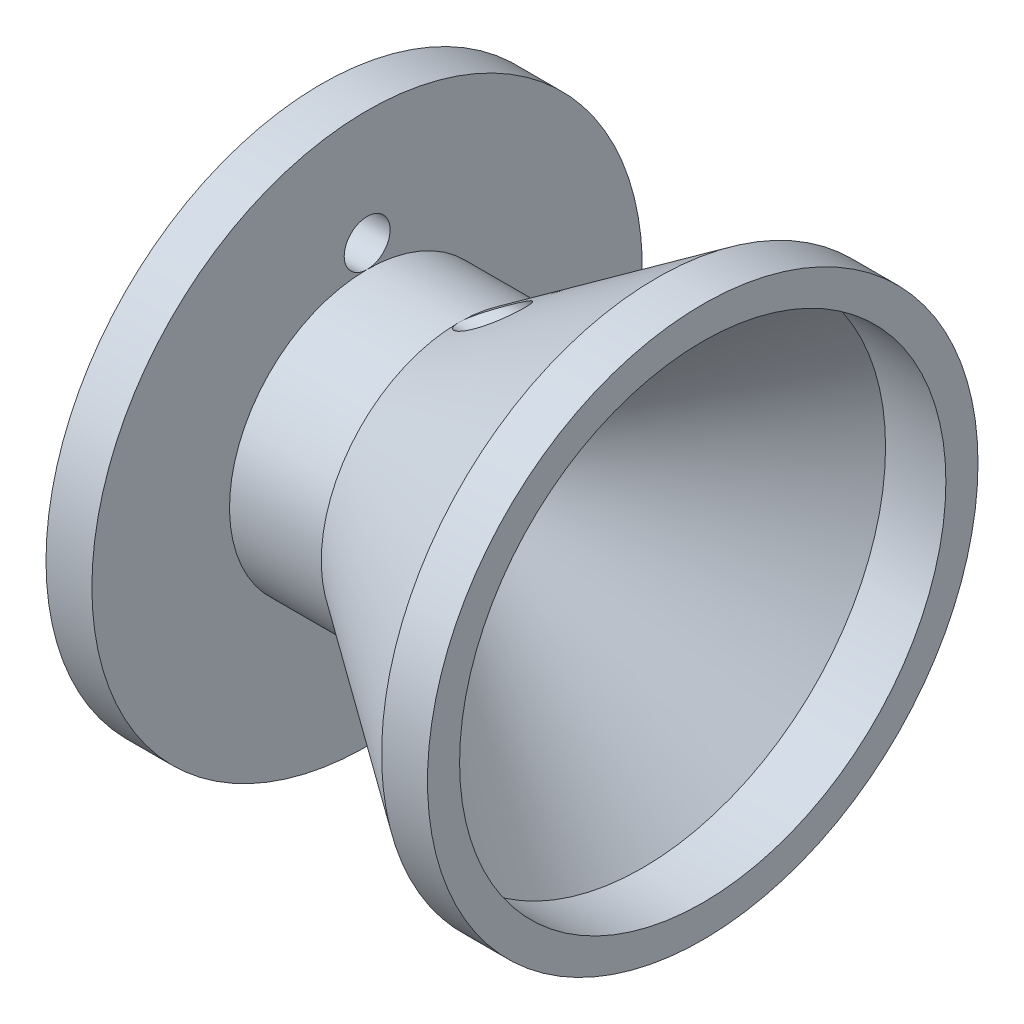
ISO-10303-21;
HEADER;
FILE_DESCRIPTION(('STEP AP214'),'2;1');
FILE_NAME('part.step','',(''),(''),'','','');
FILE_SCHEMA(('AUTOMOTIVE_DESIGN { 1 0 10303 214 1 1 1 1 }'));
ENDSEC;
DATA;
#1=APPLICATION_CONTEXT('core data for automotive mechanical design processes');
#2=APPLICATION_PROTOCOL_DEFINITION('international standard','automotive_design',2000,#1);
#3=PRODUCT_CONTEXT('',#1,'mechanical');
#4=PRODUCT('Part','Part','',(#3));
#5=PRODUCT_RELATED_PRODUCT_CATEGORY('part','',(#4));
#6=PRODUCT_DEFINITION_FORMATION('','',#4);
#7=PRODUCT_DEFINITION_CONTEXT('part definition',#1,'design');
#8=PRODUCT_DEFINITION('design','',#6,#7);
#9=PRODUCT_DEFINITION_SHAPE('','',#8);
#10=(LENGTH_UNIT() NAMED_UNIT(*) SI_UNIT(.MILLI.,.METRE.));
#11=(NAMED_UNIT(*) PLANE_ANGLE_UNIT() SI_UNIT($,.RADIAN.));
#12=(NAMED_UNIT(*) SI_UNIT($,.STERADIAN.) SOLID_ANGLE_UNIT());
#13=UNCERTAINTY_MEASURE_WITH_UNIT(LENGTH_MEASURE(1.E-05),#10,'distance_accuracy_value','');
#14=(GEOMETRIC_REPRESENTATION_CONTEXT(3) GLOBAL_UNCERTAINTY_ASSIGNED_CONTEXT((#13)) GLOBAL_UNIT_ASSIGNED_CONTEXT((#10,
#11,#12)) REPRESENTATION_CONTEXT('',''));
#15=CARTESIAN_POINT('',(0.,0.,0.));
#16=DIRECTION('',(0.,0.,1.));
#17=DIRECTION('',(1.,0.,0.));
#18=AXIS2_PLACEMENT_3D('',#15,#16,#17);
#19=CARTESIAN_POINT('',(12.,12.,12.));
#20=DIRECTION('',(-1.,0.,0.));
#21=DIRECTION('',(0.,0.,1.));
#22=AXIS2_PLACEMENT_3D('',#19,#20,#21);
#23=CYLINDRICAL_SURFACE('',#22,12.);
#24=CARTESIAN_POINT('',(14.63,12.,12.));
#25=DIRECTION('',(1.,0.,0.));
#26=DIRECTION('',(0.,0.,-1.));
#27=AXIS2_PLACEMENT_3D('',#24,#25,#26);
#28=CIRCLE('',#27,12.);
#29=CARTESIAN_POINT('',(14.63,12.,0.));
#30=VERTEX_POINT('',#29);
#31=EDGE_CURVE('E84',#30,#30,#28,.T.);
#32=ORIENTED_EDGE('',*,*,#31,.F.);
#33=EDGE_LOOP('',(#32));
#34=FACE_BOUND('',#33,.T.);
#35=CARTESIAN_POINT('',(12.63,12.,12.));
#36=DIRECTION('',(1.,0.,0.));
#37=DIRECTION('',(0.,0.,-1.));
#38=AXIS2_PLACEMENT_3D('',#35,#36,#37);
#39=CIRCLE('',#38,12.);
#40=CARTESIAN_POINT('',(12.63,12.,0.));
#41=VERTEX_POINT('',#40);
#42=EDGE_CURVE('E114',#41,#41,#39,.T.);
#43=ORIENTED_EDGE('',*,*,#42,.T.);
#44=EDGE_LOOP('',(#43));
#45=FACE_BOUND('',#44,.T.);
#46=ADVANCED_FACE('F45',(#34,#45),#23,.T.);
#47=CARTESIAN_POINT('',(48.,19.,12.));
#48=DIRECTION('',(-1.,0.,0.));
#49=DIRECTION('',(0.,0.,1.));
#50=AXIS2_PLACEMENT_3D('',#47,#48,#49);
#51=CYLINDRICAL_SURFACE('',#50,1.);
#52=CARTESIAN_POINT('',(9.33017925939777,19.9205530775845,12.3906175000557));
#53=CARTESIAN_POINT('',(9.31075114274671,19.8985433378205,12.44247297199));
#54=CARTESIAN_POINT('',(9.28775626365183,19.8725740585792,12.491422278081));
#55=CARTESIAN_POINT('',(9.23618243469897,19.8146490916046,12.5824856636763));
#56=CARTESIAN_POINT('',(9.20757826695552,19.7826663969329,12.6245672413248));
#57=CARTESIAN_POINT('',(9.13920647714863,19.7067075370633,12.7103107576778));
#58=CARTESIAN_POINT('',(9.09837816770717,19.6616561586324,12.7521681068706));
#59=CARTESIAN_POINT('',(9.0123661533531,19.5675899736042,12.8254737911489));
#60=CARTESIAN_POINT('',(8.96718035808321,19.5185732666087,12.8569170980528));
#61=CARTESIAN_POINT('',(8.85895660612349,19.4023045873099,12.9185570867299));
#62=CARTESIAN_POINT('',(8.79480490815994,19.3342032875128,12.9451896347475));
#63=CARTESIAN_POINT('',(8.66347770865847,19.1966984712546,12.9830591404249));
#64=CARTESIAN_POINT('',(8.59629900106422,19.1272936217586,12.9942793584964));
#65=CARTESIAN_POINT('',(8.45934531605116,18.987827574803,13.0024050361181));
#66=CARTESIAN_POINT('',(8.38954542406175,18.9177765623652,12.9990531315719));
#67=CARTESIAN_POINT('',(8.24998037326568,18.7798118071044,12.9779514730343));
#68=CARTESIAN_POINT('',(8.1802152194349,18.7118983134684,12.9602000467894));
#69=CARTESIAN_POINT('',(8.04724705392241,18.5844131323782,12.9119234956999));
#70=CARTESIAN_POINT('',(7.98392748382353,18.524590641074,12.882383971102));
#71=CARTESIAN_POINT('',(7.86060823709407,18.4096919335184,12.8100244834528));
#72=CARTESIAN_POINT('',(7.80060349322348,18.3546083968831,12.7672254909971));
#73=CARTESIAN_POINT('',(7.70645375520955,18.2692822627952,12.6843033722741));
#74=CARTESIAN_POINT('',(7.6705075052636,18.2370074801461,12.6483135981689));
#75=CARTESIAN_POINT('',(7.60269199892421,18.1765891574752,12.5696044569454));
#76=CARTESIAN_POINT('',(7.57081678652361,18.1484395731027,12.5268951298229));
#77=CARTESIAN_POINT('',(7.52003390655837,18.1038806428,12.4456145503246));
#78=CARTESIAN_POINT('',(7.49984938277972,18.0862745565097,12.4085055892172));
#79=CARTESIAN_POINT('',(7.46414612920811,18.0552535440822,12.3304681708559));
#80=CARTESIAN_POINT('',(7.44862089391286,18.0418327731898,12.2895451446556));
#81=CARTESIAN_POINT('',(7.42556971940805,18.0219556303404,12.2115901347126));
#82=CARTESIAN_POINT('',(7.41714790429687,18.0147166885762,12.1750258209518));
#83=CARTESIAN_POINT('',(7.40508673750228,18.0043592323075,12.100545943482));
#84=CARTESIAN_POINT('',(7.401444149957,18.0012379298735,12.0626313119132));
#85=CARTESIAN_POINT('',(7.39925900520462,17.9993647921611,11.9864658399914));
#86=CARTESIAN_POINT('',(7.40072693410073,18.0006219408869,11.948214469191));
#87=CARTESIAN_POINT('',(7.40865065434625,18.0074191328017,11.872621813915));
#88=CARTESIAN_POINT('',(7.41510843024446,18.0129608800505,11.8352808976397));
#89=CARTESIAN_POINT('',(7.43229345080156,18.0277495477946,11.7632407301839));
#90=CARTESIAN_POINT('',(7.44292938584377,18.0369172539382,11.7285027570606));
#91=CARTESIAN_POINT('',(7.46777905745319,18.0584134245711,11.6613867793909));
#92=CARTESIAN_POINT('',(7.48199434001563,18.0707432548909,11.6290098024212));
#93=CARTESIAN_POINT('',(7.52193569564445,18.1055367012051,11.5497756148684));
#94=CARTESIAN_POINT('',(7.54969237624421,18.129843955885,11.5047493575443));
#95=CARTESIAN_POINT('',(7.61000761369345,18.1830911798965,11.4210941364123));
#96=CARTESIAN_POINT('',(7.64257887087161,18.2120434199863,11.3824826844942));
#97=CARTESIAN_POINT('',(7.72656724215055,18.2873566966712,11.2951482546054));
#98=CARTESIAN_POINT('',(7.7798066902739,18.3356370582277,11.2498399867908));
#99=CARTESIAN_POINT('',(7.89013744651056,18.4370580133804,11.1710075112159));
#100=CARTESIAN_POINT('',(7.94723440357425,18.4902057771346,11.1375010522703));
#101=CARTESIAN_POINT('',(8.08056895976431,18.6160264034317,11.0732236022831));
#102=CARTESIAN_POINT('',(8.15750565751286,18.6898514363039,11.0461421348696));
#103=CARTESIAN_POINT('',(8.31225215853798,18.8409442317202,11.009674927801));
#104=CARTESIAN_POINT('',(8.3900628132803,18.9182156181801,11.0003082871993));
#105=CARTESIAN_POINT('',(8.54494037593803,19.0745813434864,10.9997046169268));
#106=CARTESIAN_POINT('',(8.62199963457183,19.1536840380307,11.0085808522837));
#107=CARTESIAN_POINT('',(8.77251971644381,19.3106014975334,11.0460556811667));
#108=CARTESIAN_POINT('',(8.84598835491456,19.3884187910141,11.0746091922761));
#109=CARTESIAN_POINT('',(8.9613242703613,19.5122540115348,11.1394185405039));
#110=CARTESIAN_POINT('',(9.00516181361281,19.5597659581886,11.1693561297225));
#111=CARTESIAN_POINT('',(9.08881678507618,19.651154804155,11.2388929693238));
#112=CARTESIAN_POINT('',(9.12863999078595,19.6950369107742,11.2784780459234));
#113=CARTESIAN_POINT('',(9.19465519623506,19.7682714408776,11.3581081812015));
#114=CARTESIAN_POINT('',(9.22193880009028,19.7987214373879,11.3962331841705));
#115=CARTESIAN_POINT('',(9.27192846942013,19.8547596294178,11.4785999927412));
#116=CARTESIAN_POINT('',(9.29463979525632,19.8803534099936,11.5228346692415));
#117=CARTESIAN_POINT('',(9.3308790087273,19.9213264078015,11.608817407619));
#118=CARTESIAN_POINT('',(9.3453122059246,19.9377029395606,11.6497056424218));
#119=CARTESIAN_POINT('',(9.36946052051875,19.9651538795859,11.7345542085725));
#120=CARTESIAN_POINT('',(9.37917858010852,19.9762315941934,11.7785126045319));
#121=CARTESIAN_POINT('',(9.3933385300539,19.992386363676,11.8685803682292));
#122=CARTESIAN_POINT('',(9.39775567984746,19.9974352802248,11.9146987862768));
#123=CARTESIAN_POINT('',(9.4009163372701,20.0010470880333,12.0074024132576));
#124=CARTESIAN_POINT('',(9.39965882623039,19.9996088147657,12.0539877045022));
#125=CARTESIAN_POINT('',(9.39189531796824,19.9907413133481,12.142276129684));
#126=CARTESIAN_POINT('',(9.38582121055548,19.983805090315,12.1840697961231));
#127=CARTESIAN_POINT('',(9.36931670549173,19.9649958353175,12.2655689083097));
#128=CARTESIAN_POINT('',(9.35889329406206,19.9531307206923,12.3052775884897));
#129=CARTESIAN_POINT('',(9.34143162339152,19.9333078599969,12.3594824116148));
#130=CARTESIAN_POINT('',(9.33596352207592,19.927105957545,12.3751787585474));
#131=CARTESIAN_POINT('',(9.33017925939777,19.9205530775845,12.3906175000557));
#132=B_SPLINE_CURVE_WITH_KNOTS('',3,(#52,#53,#54,#55,#56,#57,#58,#59,#60,#61,#62,#63,#64,#65,
#66,#67,#68,#69,#70,#71,#72,#73,#74,#75,#76,#77,#78,#79,#80,#81,#82,#83,#84,#85,#86,#87,#88,#89,
#90,#91,#92,#93,#94,#95,#96,#97,#98,#99,#100,#101,#102,#103,#104,#105,#106,#107,#108,#109,#110,
#111,#112,#113,#114,#115,#116,#117,#118,#119,#120,#121,#122,#123,#124,#125,#126,#127,#128,#129,
#130,#131),.UNSPECIFIED.,.T.,.F.,(4,2,2,2,2,2,2,2,2,2,2,2,2,2,2,2,2,2,2,2,2,2,2,2,2,2,2,2,2,2,2,
2,2,2,2,2,2,2,2,4),(0.,0.17871221089598,0.358247087796716,0.578484198389451,0.798827490928976,
1.0891157384978,1.37971902433362,1.67547542381294,1.97126617516469,2.24626515954673,
2.52083141886618,2.70105784477098,2.88101749955363,3.01783777563337,3.15446611884785,
3.26861397439845,3.38268450414195,3.49698922933851,3.61133943892354,3.72331845264719,
3.83534591566975,4.00899402860083,4.18310866271044,4.4365977524336,4.6904664544158,
5.01884949611941,5.34758637915288,5.6783704642954,6.00839920183975,6.22143928903462,
6.43416825154415,6.60126599440556,6.76817038027452,6.90664564968333,7.04503440059757,
7.18406656240745,7.32312368312916,7.45095513312017,7.57858203505205,7.63178937316833),.UNSPECIFIED.);
#133=CARTESIAN_POINT('',(9.33017925939777,19.9205530775845,12.3906175000557));
#134=VERTEX_POINT('',#133);
#135=EDGE_CURVE('E51',#134,#134,#132,.T.);
#136=ORIENTED_EDGE('',*,*,#135,.T.);
#137=EDGE_LOOP('',(#136));
#138=FACE_BOUND('',#137,.T.);
#139=CARTESIAN_POINT('',(4.40293240857594,18.2457241063854,11.3434423233877));
#140=CARTESIAN_POINT('',(4.44628297337378,18.2727641558073,11.3123772749513));
#141=CARTESIAN_POINT('',(4.49092850828376,18.3008078844389,11.2840125946292));
#142=CARTESIAN_POINT('',(4.58195611134168,18.3584253358973,11.2319576063296));
#143=CARTESIAN_POINT('',(4.62833979238464,18.3880004900214,11.2082717745705));
#144=CARTESIAN_POINT('',(4.72245072867775,18.4484723223752,11.1650123614738));
#145=CARTESIAN_POINT('',(4.77018276384847,18.4793739788617,11.1454562670796));
#146=CARTESIAN_POINT('',(4.86642929814047,18.5421683226007,11.1102328282135));
#147=CARTESIAN_POINT('',(4.91494401541581,18.5740612885354,11.0945665886096));
#148=CARTESIAN_POINT('',(5.0324481798698,18.6519051774671,11.0612315231402));
#149=CARTESIAN_POINT('',(5.10168508147372,18.6982637534419,11.0453705584746));
#150=CARTESIAN_POINT('',(5.24056745270534,18.7922585039973,11.0206096821607));
#151=CARTESIAN_POINT('',(5.31021311508869,18.839895326823,11.0117133742838));
#152=CARTESIAN_POINT('',(5.4493098691186,18.9360403841126,11.000877457986));
#153=CARTESIAN_POINT('',(5.51876109661839,18.9845472839885,10.9989279812196));
#154=CARTESIAN_POINT('',(5.65703563542604,19.0821101873946,11.0021831317591));
#155=CARTESIAN_POINT('',(5.72585926220369,19.1311658839071,11.0073839397558));
#156=CARTESIAN_POINT('',(5.88622254054825,19.2466008845581,11.0285387411028));
#157=CARTESIAN_POINT('',(5.97733895103311,19.3130722361096,11.0476031903253));
#158=CARTESIAN_POINT('',(6.11099901700916,19.4117952220287,11.0880343300412));
#159=CARTESIAN_POINT('',(6.15502831910602,19.4445224817414,11.1034729321172));
#160=CARTESIAN_POINT('',(6.24176957382369,19.5093822184592,11.1386687623264));
#161=CARTESIAN_POINT('',(6.28448210672959,19.5415149548935,11.1584240561784));
#162=CARTESIAN_POINT('',(6.37936466886369,19.6133002635991,11.2086305227701));
#163=CARTESIAN_POINT('',(6.4310045851915,19.6526624621719,11.2405292613783));
#164=CARTESIAN_POINT('',(6.53003243141091,19.7286390364843,11.3130938227406));
#165=CARTESIAN_POINT('',(6.57742576018577,19.7652568912551,11.3537482834004));
#166=CARTESIAN_POINT('',(6.65310379230284,19.8240545296136,11.432021755652));
#167=CARTESIAN_POINT('',(6.68298986853447,19.8473788977052,11.4672163209486));
#168=CARTESIAN_POINT('',(6.73810250806339,19.8905378493739,11.5430133020236));
#169=CARTESIAN_POINT('',(6.763336426391,19.9103779391744,11.5836070037871));
#170=CARTESIAN_POINT('',(6.80239324715166,19.941164913777,11.6601501154448));
#171=CARTESIAN_POINT('',(6.81750597379604,19.9531078997677,11.6950336763814));
#172=CARTESIAN_POINT('',(6.84304736517481,19.9733204641057,11.7674965432831));
#173=CARTESIAN_POINT('',(6.85347973933996,19.981592951463,11.8050736869451));
#174=CARTESIAN_POINT('',(6.86889971945204,19.9938285550267,11.8823404518066));
#175=CARTESIAN_POINT('',(6.8738459669363,19.9977589363737,11.9220437851379));
#176=CARTESIAN_POINT('',(6.87766769381627,20.0007952627776,12.001922569819));
#177=CARTESIAN_POINT('',(6.87654576525055,19.9999032677263,12.042097812275));
#178=CARTESIAN_POINT('',(6.86882956327758,19.9937746161223,12.1168622680584));
#179=CARTESIAN_POINT('',(6.86287723571762,19.9890476365347,12.1515639614357));
#180=CARTESIAN_POINT('',(6.84675581899237,19.9762623819599,12.2193221833807));
#181=CARTESIAN_POINT('',(6.83658512333807,19.9682028378294,12.2523780797989));
#182=CARTESIAN_POINT('',(6.80863007106097,19.9460912311966,12.3269328638836));
#183=CARTESIAN_POINT('',(6.7894380190028,19.9309372524358,12.3675750650857));
#184=CARTESIAN_POINT('',(6.74610551763846,19.8968322518691,12.4443723909753));
#185=CARTESIAN_POINT('',(6.72195533143078,19.8778737603478,12.480518458261));
#186=CARTESIAN_POINT('',(6.6580539318027,19.8278976402971,12.5638346809883));
#187=CARTESIAN_POINT('',(6.61622421888744,19.7953344939788,12.6084685716443));
#188=CARTESIAN_POINT('',(6.52745363400783,19.7266676918075,12.6890326363499));
#189=CARTESIAN_POINT('',(6.48050246362361,19.6905569172858,12.7249447868032));
#190=CARTESIAN_POINT('',(6.39309630497161,19.62379096354,12.7825667396327));
#191=CARTESIAN_POINT('',(6.35325661390166,19.5935158096762,12.8056797384461));
#192=CARTESIAN_POINT('',(6.2719623030953,19.5320877828112,12.8475040238878));
#193=CARTESIAN_POINT('',(6.230506769121,19.5009344157619,12.8662127752031));
#194=CARTESIAN_POINT('',(6.10424833012133,19.4066151377853,12.9163803970968));
#195=CARTESIAN_POINT('',(6.01762284242353,19.3426430767951,12.9418374783116));
#196=CARTESIAN_POINT('',(5.86507294167971,19.2314037953313,12.9740921087023));
#197=CARTESIAN_POINT('',(5.79971735155917,19.1841826776705,12.9840407782333));
#198=CARTESIAN_POINT('',(5.66808831455722,19.0899816216771,12.9970785866338));
#199=CARTESIAN_POINT('',(5.6018144114151,19.0430018203821,13.0001641829493));
#200=CARTESIAN_POINT('',(5.46875805101483,18.9496029616764,12.9998221459536));
#201=CARTESIAN_POINT('',(5.40197497804371,18.9031848556207,12.9963846937208));
#202=CARTESIAN_POINT('',(5.26842545452808,18.8112860602218,12.9831286662177));
#203=CARTESIAN_POINT('',(5.20165900672121,18.7658050375184,12.9733124020569));
#204=CARTESIAN_POINT('',(5.08136709316957,18.6846906594248,12.9497388378276));
#205=CARTESIAN_POINT('',(5.02776330310297,18.6488448024938,12.9371017400017));
#206=CARTESIAN_POINT('',(4.92112906819844,18.5781233969034,12.907463746886));
#207=CARTESIAN_POINT('',(4.86809851423388,18.5432476615003,12.8904636979773));
#208=CARTESIAN_POINT('',(4.76317666598929,18.4748131657734,12.8518897335114));
#209=CARTESIAN_POINT('',(4.71128165410016,18.4412496824032,12.8303344451544));
#210=CARTESIAN_POINT('',(4.60895231409541,18.3756046498811,12.7821686806351));
#211=CARTESIAN_POINT('',(4.5585168855054,18.3435219727892,12.7555621337666));
#212=CARTESIAN_POINT('',(4.46479287795249,18.2843738169927,12.6995489553152));
#213=CARTESIAN_POINT('',(4.42129440771217,18.2571276545217,12.6706896088583));
#214=CARTESIAN_POINT('',(4.33688401536243,18.2046154851001,12.6074988918326));
#215=CARTESIAN_POINT('',(4.29597860327162,18.1793544265399,12.5731544559318));
#216=CARTESIAN_POINT('',(4.21781039318862,18.1313838707779,12.4975442113376));
#217=CARTESIAN_POINT('',(4.18061245150044,18.1087190192924,12.4561810872735));
#218=CARTESIAN_POINT('',(4.11352724053155,18.0680605920529,12.3659306588487));
#219=CARTESIAN_POINT('',(4.08359813081104,18.0500402432403,12.3170891897222));
#220=CARTESIAN_POINT('',(4.04694322558946,18.0280451278385,12.2369068139269));
#221=CARTESIAN_POINT('',(4.03594320128644,18.0214613714609,12.208242973502));
#222=CARTESIAN_POINT('',(4.01801368965979,18.0107433006263,12.1492224850171));
#223=CARTESIAN_POINT('',(4.01108006106003,18.0066064941233,12.1188675937773));
#224=CARTESIAN_POINT('',(4.00191288168589,18.001139275928,12.0569820704453));
#225=CARTESIAN_POINT('',(3.99971041339515,17.9998274233048,12.0254450396319));
#226=CARTESIAN_POINT('',(4.00035116600848,18.0002092736411,11.9624394153051));
#227=CARTESIAN_POINT('',(4.00319454543074,18.0019030710248,11.9309708239729));
#228=CARTESIAN_POINT('',(4.01319610825531,18.0078692055526,11.8715474950462));
#229=CARTESIAN_POINT('',(4.02000197376527,18.0119310291414,11.8435096845962));
#230=CARTESIAN_POINT('',(4.03707117229449,18.0221366791297,11.7889168860302));
#231=CARTESIAN_POINT('',(4.04733651676938,18.0282817167913,11.7623627710795));
#232=CARTESIAN_POINT('',(4.07710067668132,18.0461405234375,11.6969304162394));
#233=CARTESIAN_POINT('',(4.09857533874079,18.0590597848598,11.6592842428522));
#234=CARTESIAN_POINT('',(4.14621289134357,18.0878507696889,11.5883464668789));
#235=CARTESIAN_POINT('',(4.17238805536187,18.1037302266942,11.5550666687489));
#236=CARTESIAN_POINT('',(4.23088659705899,18.1393997449631,11.4892022643983));
#237=CARTESIAN_POINT('',(4.26356791384548,18.1594262133705,11.4570697038988));
#238=CARTESIAN_POINT('',(4.33151099372381,18.2013111144213,11.3971476408747));
#239=CARTESIAN_POINT('',(4.36677116787208,18.2231684201943,11.3693554965891));
#240=CARTESIAN_POINT('',(4.40293240857594,18.2457241063854,11.3434423233877));
#241=B_SPLINE_CURVE_WITH_KNOTS('',3,(#139,#140,#141,#142,#143,#144,#145,#146,#147,#148,#149,
#150,#151,#152,#153,#154,#155,#156,#157,#158,#159,#160,#161,#162,#163,#164,#165,#166,#167,#168,
#169,#170,#171,#172,#173,#174,#175,#176,#177,#178,#179,#180,#181,#182,#183,#184,#185,#186,#187,
#188,#189,#190,#191,#192,#193,#194,#195,#196,#197,#198,#199,#200,#201,#202,#203,#204,#205,#206,
#207,#208,#209,#210,#211,#212,#213,#214,#215,#216,#217,#218,#219,#220,#221,#222,#223,#224,#225,
#226,#227,#228,#229,#230,#231,#232,#233,#234,#235,#236,#237,#238,#239,#240),.UNSPECIFIED.,.T.,
.F.,(4,2,2,2,2,2,2,2,2,2,2,2,2,2,2,2,2,2,2,2,2,2,2,2,2,2,2,2,2,2,2,2,2,2,2,2,2,2,2,2,2,2,2,2,2,
2,2,2,2,2,4),(0.,0.179319781974265,0.358810295685759,0.539046243839757,0.719333327502907,
0.973462033552717,1.2277221484567,1.48162092895095,1.73538414263633,2.07739243644159,
2.24822290265808,2.418976977271,2.63545418948869,2.85165215899259,3.00636925253851,
3.16083960153671,3.27992940286886,3.398924651672,3.5188110026212,3.63864614782193,
3.74474649832067,3.85088729236999,3.99239381993463,4.13418094618551,4.34092681657204,
4.54809636252173,4.71322349517899,4.87844545238283,5.20917805158772,5.45264407407527,
5.69623573875709,5.94019436451292,6.18406465078172,6.38105946121695,6.57801608492631,
6.77418238435578,6.97019670977349,7.14658038427805,7.32339064416377,7.50288978714186,
7.6813298242368,7.7751965521005,7.86896751798127,7.96335267397814,8.0577407951911,
8.14479711605003,8.23190414191798,8.36680483269214,8.5020630243146,8.65173559396198,
8.80131670851436),.UNSPECIFIED.);
#242=CARTESIAN_POINT('',(4.00000000000002,18.,12.));
#243=VERTEX_POINT('',#242);
#244=EDGE_CURVE('E110',#243,#243,#241,.T.);
#245=ORIENTED_EDGE('',*,*,#244,.F.);
#246=EDGE_LOOP('',(#245));
#247=FACE_BOUND('',#246,.T.);
#248=ADVANCED_FACE('F105',(#138,#247),#51,.F.);
#249=CARTESIAN_POINT('',(10.,12.,12.));
#250=DIRECTION('',(-1.,0.,0.));
#251=DIRECTION('',(0.,0.,1.));
#252=AXIS2_PLACEMENT_3D('',#249,#250,#251);
#253=CYLINDRICAL_SURFACE('',#252,6.);
#254=CARTESIAN_POINT('',(4.00000000000002,12.,12.));
#255=DIRECTION('',(1.,0.,0.));
#256=DIRECTION('',(0.,0.,-1.));
#257=AXIS2_PLACEMENT_3D('',#254,#255,#256);
#258=CIRCLE('',#257,6.);
#259=EDGE_CURVE('E66',#243,#243,#258,.F.);
#260=ORIENTED_EDGE('',*,*,#259,.T.);
#261=EDGE_LOOP('',(#260));
#262=FACE_BOUND('',#261,.T.);
#263=CARTESIAN_POINT('',(0.,12.,12.));
#264=DIRECTION('',(1.,0.,0.));
#265=DIRECTION('',(0.,0.,-1.));
#266=AXIS2_PLACEMENT_3D('',#263,#264,#265);
#267=CIRCLE('',#266,6.);
#268=CARTESIAN_POINT('',(0.,18.,12.));
#269=VERTEX_POINT('',#268);
#270=EDGE_CURVE('E172',#269,#269,#267,.T.);
#271=ORIENTED_EDGE('',*,*,#270,.T.);
#272=EDGE_LOOP('',(#271));
#273=FACE_BOUND('',#272,.T.);
#274=ADVANCED_FACE('F108',(#262,#273),#253,.T.);
#275=CARTESIAN_POINT('',(-2.,12.,12.));
#276=DIRECTION('',(1.,0.,0.));
#277=DIRECTION('',(0.,0.,-1.));
#278=AXIS2_PLACEMENT_3D('',#275,#276,#277);
#279=CYLINDRICAL_SURFACE('',#278,12.);
#280=CARTESIAN_POINT('',(-2.,12.,12.));
#281=DIRECTION('',(-1.,0.,0.));
#282=DIRECTION('',(0.,0.,1.));
#283=AXIS2_PLACEMENT_3D('',#280,#281,#282);
#284=CIRCLE('',#283,12.);
#285=CARTESIAN_POINT('',(-2.,12.,24.));
#286=VERTEX_POINT('',#285);
#287=EDGE_CURVE('E175',#286,#286,#284,.T.);
#288=ORIENTED_EDGE('',*,*,#287,.F.);
#289=EDGE_LOOP('',(#288));
#290=FACE_BOUND('',#289,.T.);
#291=CARTESIAN_POINT('',(0.,12.,12.));
#292=DIRECTION('',(-1.,0.,0.));
#293=DIRECTION('',(0.,0.,1.));
#294=AXIS2_PLACEMENT_3D('',#291,#292,#293);
#295=CIRCLE('',#294,12.);
#296=CARTESIAN_POINT('',(0.,12.,24.));
#297=VERTEX_POINT('',#296);
#298=EDGE_CURVE('E82',#297,#297,#295,.T.);
#299=ORIENTED_EDGE('',*,*,#298,.T.);
#300=EDGE_LOOP('',(#299));
#301=FACE_BOUND('',#300,.T.);
#302=ADVANCED_FACE('F153',(#290,#301),#279,.T.);
#303=CARTESIAN_POINT('',(-2.,12.,12.));
#304=DIRECTION('',(-1.,0.,0.));
#305=DIRECTION('',(0.,0.,1.));
#306=AXIS2_PLACEMENT_3D('',#303,#304,#305);
#307=PLANE('',#306);
#308=CARTESIAN_POINT('',(-2.,19.,12.));
#309=DIRECTION('',(-1.,0.,0.));
#310=DIRECTION('',(0.,0.,1.));
#311=AXIS2_PLACEMENT_3D('',#308,#309,#310);
#312=CIRCLE('',#311,1.);
#313=CARTESIAN_POINT('',(-2.,19.,13.));
#314=VERTEX_POINT('',#313);
#315=EDGE_CURVE('E77',#314,#314,#312,.T.);
#316=ORIENTED_EDGE('',*,*,#315,.F.);
#317=EDGE_LOOP('',(#316));
#318=FACE_BOUND('',#317,.T.);
#319=CARTESIAN_POINT('',(-2.,12.,12.));
#320=DIRECTION('',(-1.,0.,0.));
#321=DIRECTION('',(0.,0.,1.));
#322=AXIS2_PLACEMENT_3D('',#319,#320,#321);
#323=CIRCLE('',#322,3.);
#324=CARTESIAN_POINT('',(-2.,12.,15.));
#325=VERTEX_POINT('',#324);
#326=EDGE_CURVE('E88',#325,#325,#323,.F.);
#327=ORIENTED_EDGE('',*,*,#326,.T.);
#328=EDGE_LOOP('',(#327));
#329=FACE_BOUND('',#328,.T.);
#330=ORIENTED_EDGE('',*,*,#287,.T.);
#331=EDGE_LOOP('',(#330));
#332=FACE_BOUND('',#331,.T.);
#333=ADVANCED_FACE('F186',(#318,#329,#332),#307,.T.);
#334=CARTESIAN_POINT('',(0.,12.,12.));
#335=DIRECTION('',(-1.,0.,0.));
#336=DIRECTION('',(0.,0.,1.));
#337=AXIS2_PLACEMENT_3D('',#334,#335,#336);
#338=PLANE('',#337);
#339=ORIENTED_EDGE('',*,*,#270,.F.);
#340=CARTESIAN_POINT('',(0.,19.,12.));
#341=DIRECTION('',(-1.,0.,0.));
#342=DIRECTION('',(0.,0.,1.));
#343=AXIS2_PLACEMENT_3D('',#340,#341,#342);
#344=CIRCLE('',#343,1.);
#345=EDGE_CURVE('E71',#269,#269,#344,.T.);
#346=ORIENTED_EDGE('',*,*,#345,.T.);
#347=EDGE_LOOP('',(#339,#346));
#348=FACE_BOUND('',#347,.T.);
#349=ORIENTED_EDGE('',*,*,#298,.F.);
#350=EDGE_LOOP('',(#349));
#351=FACE_BOUND('',#350,.T.);
#352=ADVANCED_FACE('F164',(#348,#351),#338,.F.);
#353=CARTESIAN_POINT('',(20.,12.,12.));
#354=DIRECTION('',(-1.,0.,0.));
#355=DIRECTION('',(0.,0.,1.));
#356=AXIS2_PLACEMENT_3D('',#353,#354,#355);
#357=CYLINDRICAL_SURFACE('',#356,2.6);
#358=CARTESIAN_POINT('',(4.,12.,12.));
#359=DIRECTION('',(1.,0.,0.));
#360=DIRECTION('',(0.,0.,-1.));
#361=AXIS2_PLACEMENT_3D('',#358,#359,#360);
#362=CIRCLE('',#361,2.6);
#363=CARTESIAN_POINT('',(4.,12.,9.4));
#364=VERTEX_POINT('',#363);
#365=EDGE_CURVE('E61',#364,#364,#362,.T.);
#366=ORIENTED_EDGE('',*,*,#365,.T.);
#367=EDGE_LOOP('',(#366));
#368=FACE_BOUND('',#367,.T.);
#369=CARTESIAN_POINT('',(-1.6,12.,12.));
#370=DIRECTION('',(-1.,0.,0.));
#371=DIRECTION('',(0.,0.,1.));
#372=AXIS2_PLACEMENT_3D('',#369,#370,#371);
#373=CIRCLE('',#372,2.6);
#374=CARTESIAN_POINT('',(-1.6,12.,14.6));
#375=VERTEX_POINT('',#374);
#376=EDGE_CURVE('E170',#375,#375,#373,.T.);
#377=ORIENTED_EDGE('',*,*,#376,.T.);
#378=EDGE_LOOP('',(#377));
#379=FACE_BOUND('',#378,.T.);
#380=ADVANCED_FACE('F96',(#368,#379),#357,.F.);
#381=CARTESIAN_POINT('',(-1.6,12.,12.));
#382=DIRECTION('',(-1.,0.,0.));
#383=DIRECTION('',(0.,0.,1.));
#384=AXIS2_PLACEMENT_3D('',#381,#382,#383);
#385=TOROIDAL_SURFACE('',#384,3.,0.4);
#386=ORIENTED_EDGE('',*,*,#326,.F.);
#387=EDGE_LOOP('',(#386));
#388=FACE_BOUND('',#387,.T.);
#389=ORIENTED_EDGE('',*,*,#376,.F.);
#390=EDGE_LOOP('',(#389));
#391=FACE_BOUND('',#390,.T.);
#392=ADVANCED_FACE('F156',(#388,#391),#385,.T.);
#393=ORIENTED_EDGE('',*,*,#315,.T.);
#394=EDGE_LOOP('',(#393));
#395=FACE_BOUND('',#394,.T.);
#396=ORIENTED_EDGE('',*,*,#345,.F.);
#397=EDGE_LOOP('',(#396));
#398=FACE_BOUND('',#397,.T.);
#399=ADVANCED_FACE('F72',(#395,#398),#51,.F.);
#400=CARTESIAN_POINT('',(4.,12.,12.));
#401=DIRECTION('',(1.,0.,0.));
#402=DIRECTION('',(0.,0.,-1.));
#403=AXIS2_PLACEMENT_3D('',#400,#401,#402);
#404=CONICAL_SURFACE('',#403,2.6,0.785398163397451);
#405=CARTESIAN_POINT('',(12.,12.,12.));
#406=DIRECTION('',(1.,0.,0.));
#407=DIRECTION('',(0.,0.,-1.));
#408=AXIS2_PLACEMENT_3D('',#405,#406,#407);
#409=CIRCLE('',#408,10.6);
#410=CARTESIAN_POINT('',(12.,12.,1.39999999999997));
#411=VERTEX_POINT('',#410);
#412=EDGE_CURVE('E11',#411,#411,#409,.F.);
#413=ORIENTED_EDGE('',*,*,#412,.F.);
#414=EDGE_LOOP('',(#413));
#415=FACE_BOUND('',#414,.T.);
#416=ORIENTED_EDGE('',*,*,#365,.F.);
#417=EDGE_LOOP('',(#416));
#418=FACE_BOUND('',#417,.T.);
#419=ORIENTED_EDGE('',*,*,#135,.F.);
#420=EDGE_LOOP('',(#419));
#421=FACE_BOUND('',#420,.T.);
#422=ADVANCED_FACE('F48',(#415,#418,#421),#404,.F.);
#423=CARTESIAN_POINT('',(14.63,12.,12.));
#424=DIRECTION('',(1.,0.,0.));
#425=DIRECTION('',(0.,0.,-1.));
#426=AXIS2_PLACEMENT_3D('',#423,#424,#425);
#427=PLANE('',#426);
#428=ORIENTED_EDGE('',*,*,#31,.T.);
#429=EDGE_LOOP('',(#428));
#430=FACE_BOUND('',#429,.T.);
#431=CARTESIAN_POINT('',(14.63,12.,12.));
#432=DIRECTION('',(1.,0.,0.));
#433=DIRECTION('',(0.,0.,-1.));
#434=AXIS2_PLACEMENT_3D('',#431,#432,#433);
#435=CIRCLE('',#434,10.6);
#436=CARTESIAN_POINT('',(14.63,12.,1.39999999999997));
#437=VERTEX_POINT('',#436);
#438=EDGE_CURVE('E113',#437,#437,#435,.T.);
#439=ORIENTED_EDGE('',*,*,#438,.F.);
#440=EDGE_LOOP('',(#439));
#441=FACE_BOUND('',#440,.T.);
#442=ADVANCED_FACE('F101',(#430,#441),#427,.T.);
#443=CARTESIAN_POINT('',(14.63,12.,12.));
#444=DIRECTION('',(-1.,0.,0.));
#445=DIRECTION('',(0.,0.,1.));
#446=AXIS2_PLACEMENT_3D('',#443,#444,#445);
#447=CYLINDRICAL_SURFACE('',#446,10.6);
#448=ORIENTED_EDGE('',*,*,#438,.T.);
#449=EDGE_LOOP('',(#448));
#450=FACE_BOUND('',#449,.T.);
#451=ORIENTED_EDGE('',*,*,#412,.T.);
#452=EDGE_LOOP('',(#451));
#453=FACE_BOUND('',#452,.T.);
#454=ADVANCED_FACE('F134',(#450,#453),#447,.F.);
#455=CARTESIAN_POINT('',(12.63,12.,12.));
#456=DIRECTION('',(1.,0.,0.));
#457=DIRECTION('',(0.,0.,-1.));
#458=AXIS2_PLACEMENT_3D('',#455,#456,#457);
#459=CONICAL_SURFACE('',#458,12.,0.607530340037245);
#460=ORIENTED_EDGE('',*,*,#42,.F.);
#461=EDGE_LOOP('',(#460));
#462=FACE_BOUND('',#461,.T.);
#463=ORIENTED_EDGE('',*,*,#259,.F.);
#464=ORIENTED_EDGE('',*,*,#244,.T.);
#465=EDGE_LOOP('',(#463,#464));
#466=FACE_BOUND('',#465,.T.);
#467=ADVANCED_FACE('F130',(#462,#466),#459,.T.);
#468=CLOSED_SHELL('',(#46,#248,#274,#302,#333,#352,#380,#392,#399,#422,#442,#454,#467));
#469=MANIFOLD_SOLID_BREP('B2',#468);
#470=ADVANCED_BREP_SHAPE_REPRESENTATION('',(#18,#469),#14);
#471=SHAPE_DEFINITION_REPRESENTATION(#9,#470);
ENDSEC;
END-ISO-10303-21;
